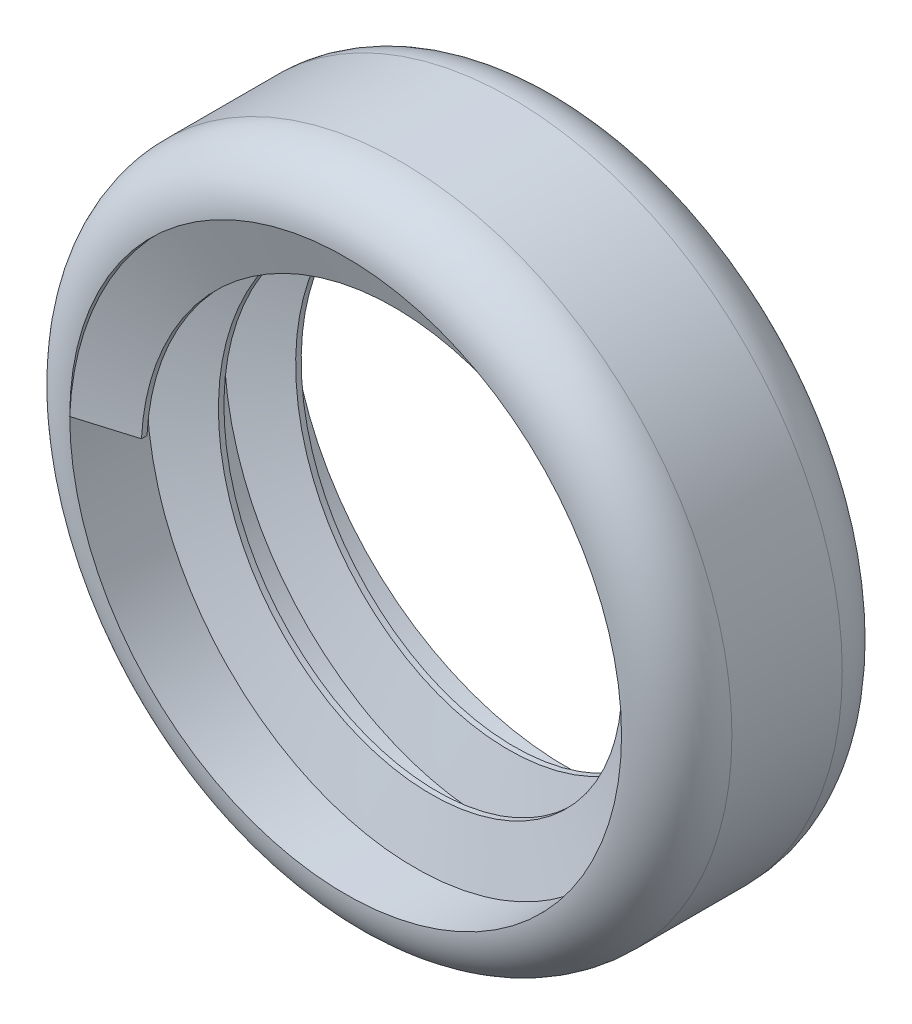
ISO-10303-21;
HEADER;
FILE_DESCRIPTION(('STEP AP214'),'2;1');
FILE_NAME('part.step','',(''),(''),'','','');
FILE_SCHEMA(('AUTOMOTIVE_DESIGN { 1 0 10303 214 1 1 1 1 }'));
ENDSEC;
DATA;
#1=APPLICATION_CONTEXT('core data for automotive mechanical design processes');
#2=APPLICATION_PROTOCOL_DEFINITION('international standard','automotive_design',2000,#1);
#3=PRODUCT_CONTEXT('',#1,'mechanical');
#4=PRODUCT('Part','Part','',(#3));
#5=PRODUCT_RELATED_PRODUCT_CATEGORY('part','',(#4));
#6=PRODUCT_DEFINITION_FORMATION('','',#4);
#7=PRODUCT_DEFINITION_CONTEXT('part definition',#1,'design');
#8=PRODUCT_DEFINITION('design','',#6,#7);
#9=PRODUCT_DEFINITION_SHAPE('','',#8);
#10=(LENGTH_UNIT() NAMED_UNIT(*) SI_UNIT(.MILLI.,.METRE.));
#11=(NAMED_UNIT(*) PLANE_ANGLE_UNIT() SI_UNIT($,.RADIAN.));
#12=(NAMED_UNIT(*) SI_UNIT($,.STERADIAN.) SOLID_ANGLE_UNIT());
#13=UNCERTAINTY_MEASURE_WITH_UNIT(LENGTH_MEASURE(1.E-05),#10,'distance_accuracy_value','');
#14=(GEOMETRIC_REPRESENTATION_CONTEXT(3) GLOBAL_UNCERTAINTY_ASSIGNED_CONTEXT((#13)) GLOBAL_UNIT_ASSIGNED_CONTEXT((#10,
#11,#12)) REPRESENTATION_CONTEXT('',''));
#15=CARTESIAN_POINT('',(0.,0.,0.));
#16=DIRECTION('',(0.,0.,1.));
#17=DIRECTION('',(1.,0.,0.));
#18=AXIS2_PLACEMENT_3D('',#15,#16,#17);
#19=CARTESIAN_POINT('',(4.25,0.,0.275));
#20=DIRECTION('',(0.,-1.,0.));
#21=DIRECTION('',(1.,0.,0.));
#22=AXIS2_PLACEMENT_3D('',#19,#20,#21);
#23=PLANE('',#22);
#24=CARTESIAN_POINT('',(5.,0.,-0.2));
#25=CARTESIAN_POINT('',(4.,0.,0.0999999999999998));
#26=(BOUNDED_CURVE() B_SPLINE_CURVE(1,(#24,#25),.UNSPECIFIED.,.F.,
.F.) B_SPLINE_CURVE_WITH_KNOTS((2,2),(0.,1.),
.UNSPECIFIED.) CURVE() GEOMETRIC_REPRESENTATION_ITEM() RATIONAL_B_SPLINE_CURVE((1.,1.)) REPRESENTATION_ITEM(''));
#27=CARTESIAN_POINT('',(4.33333333333333,0.,0.));
#28=VERTEX_POINT('',#27);
#29=CARTESIAN_POINT('',(4.,0.,0.0999999999999998));
#30=VERTEX_POINT('',#29);
#31=EDGE_CURVE('E102',#28,#30,#26,.T.);
#32=ORIENTED_EDGE('',*,*,#31,.F.);
#33=DIRECTION('',(1.,0.,0.));
#34=VECTOR('',#33,1.);
#35=CARTESIAN_POINT('',(4.25,0.,0.));
#36=LINE('',#35,#34);
#37=CARTESIAN_POINT('',(5.,0.,0.));
#38=VERTEX_POINT('',#37);
#39=EDGE_CURVE('E51',#28,#38,#36,.T.);
#40=ORIENTED_EDGE('',*,*,#39,.T.);
#41=CARTESIAN_POINT('',(5.,0.,0.5));
#42=DIRECTION('',(0.,0.,-1.));
#43=VECTOR('',#42,1.);
#44=LINE('',#41,#43);
#45=CARTESIAN_POINT('',(5.,0.,0.5));
#46=VERTEX_POINT('',#45);
#47=EDGE_CURVE('E108',#46,#38,#44,.T.);
#48=ORIENTED_EDGE('',*,*,#47,.F.);
#49=CARTESIAN_POINT('',(4.,0.,0.2));
#50=CARTESIAN_POINT('',(5.,0.,0.5));
#51=(BOUNDED_CURVE() B_SPLINE_CURVE(1,(#49,#50),.UNSPECIFIED.,.F.,
.F.) B_SPLINE_CURVE_WITH_KNOTS((2,2),(0.,1.),
.UNSPECIFIED.) CURVE() GEOMETRIC_REPRESENTATION_ITEM() RATIONAL_B_SPLINE_CURVE((1.,1.)) REPRESENTATION_ITEM(''));
#52=CARTESIAN_POINT('',(4.,0.,0.2));
#53=VERTEX_POINT('',#52);
#54=EDGE_CURVE('E110',#53,#46,#51,.T.);
#55=ORIENTED_EDGE('',*,*,#54,.F.);
#56=CARTESIAN_POINT('',(4.,0.,0.0999999999999998));
#57=CARTESIAN_POINT('',(4.,0.,0.2));
#58=(BOUNDED_CURVE() B_SPLINE_CURVE(1,(#56,#57),.UNSPECIFIED.,.F.,
.F.) B_SPLINE_CURVE_WITH_KNOTS((2,2),(0.,1.),
.UNSPECIFIED.) CURVE() GEOMETRIC_REPRESENTATION_ITEM() RATIONAL_B_SPLINE_CURVE((1.,1.)) REPRESENTATION_ITEM(''));
#59=EDGE_CURVE('E162',#30,#53,#58,.T.);
#60=ORIENTED_EDGE('',*,*,#59,.F.);
#61=EDGE_LOOP('',(#32,#40,#48,#55,#60));
#62=FACE_BOUND('',#61,.T.);
#63=ADVANCED_FACE('F36',(#62),#23,.T.);
#64=CARTESIAN_POINT('',(-4.,0.,3.6));
#65=CARTESIAN_POINT('',(-4.,1.65685424949238,3.5125));
#66=CARTESIAN_POINT('',(-2.82842712474619,2.82842712474619,3.425));
#67=CARTESIAN_POINT('',(-1.65685424949238,4.,3.3375));
#68=CARTESIAN_POINT('',(0.,4.,3.25));
#69=CARTESIAN_POINT('',(1.65685424949238,4.,3.1625));
#70=CARTESIAN_POINT('',(2.82842712474619,2.82842712474619,3.075));
#71=CARTESIAN_POINT('',(4.,1.65685424949238,2.9875));
#72=CARTESIAN_POINT('',(4.,0.,2.9));
#73=CARTESIAN_POINT('',(4.,-1.65685424949238,2.8125));
#74=CARTESIAN_POINT('',(2.82842712474619,-2.82842712474619,2.725));
#75=CARTESIAN_POINT('',(1.65685424949238,-4.,2.6375));
#76=CARTESIAN_POINT('',(0.,-4.,2.55));
#77=CARTESIAN_POINT('',(-1.65685424949238,-4.,2.4625));
#78=CARTESIAN_POINT('',(-2.82842712474619,-2.82842712474619,2.375));
#79=CARTESIAN_POINT('',(-4.,-1.65685424949238,2.2875));
#80=CARTESIAN_POINT('',(-4.,0.,2.2));
#81=CARTESIAN_POINT('',(-4.,1.65685424949238,2.1125));
#82=CARTESIAN_POINT('',(-2.82842712474619,2.82842712474619,2.025));
#83=CARTESIAN_POINT('',(-1.65685424949238,4.,1.9375));
#84=CARTESIAN_POINT('',(0.,4.,1.85));
#85=CARTESIAN_POINT('',(1.65685424949238,4.,1.7625));
#86=CARTESIAN_POINT('',(2.82842712474619,2.82842712474619,1.675));
#87=CARTESIAN_POINT('',(4.,1.65685424949238,1.5875));
#88=CARTESIAN_POINT('',(4.,0.,1.5));
#89=CARTESIAN_POINT('',(4.,-1.65685424949238,1.4125));
#90=CARTESIAN_POINT('',(2.82842712474619,-2.82842712474619,1.325));
#91=CARTESIAN_POINT('',(1.65685424949238,-4.,1.2375));
#92=CARTESIAN_POINT('',(0.,-4.,1.15));
#93=CARTESIAN_POINT('',(-1.65685424949238,-4.,1.0625));
#94=CARTESIAN_POINT('',(-2.82842712474619,-2.82842712474619,0.975));
#95=CARTESIAN_POINT('',(-4.,-1.65685424949238,0.8875));
#96=CARTESIAN_POINT('',(-4.,0.,0.8));
#97=CARTESIAN_POINT('',(-4.,1.65685424949238,0.7125));
#98=CARTESIAN_POINT('',(-2.82842712474619,2.82842712474619,0.625));
#99=CARTESIAN_POINT('',(-1.65685424949238,4.,0.5375));
#100=CARTESIAN_POINT('',(0.,4.,0.45));
#101=CARTESIAN_POINT('',(1.65685424949238,4.,0.3625));
#102=CARTESIAN_POINT('',(2.82842712474619,2.82842712474619,0.275));
#103=CARTESIAN_POINT('',(4.,1.65685424949238,0.1875));
#104=CARTESIAN_POINT('',(4.,0.,0.0999999999999998));
#105=CARTESIAN_POINT('',(-5.,0.,3.3));
#106=CARTESIAN_POINT('',(-5.,2.07106781186548,3.2125));
#107=CARTESIAN_POINT('',(-3.53553390593274,3.53553390593274,3.125));
#108=CARTESIAN_POINT('',(-2.07106781186548,5.,3.0375));
#109=CARTESIAN_POINT('',(0.,5.,2.95));
#110=CARTESIAN_POINT('',(2.07106781186548,5.,2.8625));
#111=CARTESIAN_POINT('',(3.53553390593274,3.53553390593274,2.775));
#112=CARTESIAN_POINT('',(5.,2.07106781186548,2.6875));
#113=CARTESIAN_POINT('',(5.,0.,2.6));
#114=CARTESIAN_POINT('',(5.,-2.07106781186547,2.5125));
#115=CARTESIAN_POINT('',(3.53553390593274,-3.53553390593274,2.425));
#116=CARTESIAN_POINT('',(2.07106781186548,-5.,2.3375));
#117=CARTESIAN_POINT('',(0.,-5.,2.25));
#118=CARTESIAN_POINT('',(-2.07106781186548,-5.,2.1625));
#119=CARTESIAN_POINT('',(-3.53553390593274,-3.53553390593274,2.075));
#120=CARTESIAN_POINT('',(-5.,-2.07106781186548,1.9875));
#121=CARTESIAN_POINT('',(-5.,0.,1.9));
#122=CARTESIAN_POINT('',(-5.,2.07106781186548,1.8125));
#123=CARTESIAN_POINT('',(-3.53553390593274,3.53553390593274,1.725));
#124=CARTESIAN_POINT('',(-2.07106781186548,5.,1.6375));
#125=CARTESIAN_POINT('',(0.,5.,1.55));
#126=CARTESIAN_POINT('',(2.07106781186548,5.,1.4625));
#127=CARTESIAN_POINT('',(3.53553390593274,3.53553390593274,1.375));
#128=CARTESIAN_POINT('',(5.,2.07106781186548,1.2875));
#129=CARTESIAN_POINT('',(5.,0.,1.2));
#130=CARTESIAN_POINT('',(5.,-2.07106781186547,1.1125));
#131=CARTESIAN_POINT('',(3.53553390593274,-3.53553390593274,1.025));
#132=CARTESIAN_POINT('',(2.07106781186548,-5.,0.9375));
#133=CARTESIAN_POINT('',(0.,-5.,0.85));
#134=CARTESIAN_POINT('',(-2.07106781186548,-5.,0.7625));
#135=CARTESIAN_POINT('',(-3.53553390593274,-3.53553390593274,0.675));
#136=CARTESIAN_POINT('',(-5.,-2.07106781186548,0.5875));
#137=CARTESIAN_POINT('',(-5.,0.,0.5));
#138=CARTESIAN_POINT('',(-5.,2.07106781186548,0.4125));
#139=CARTESIAN_POINT('',(-3.53553390593274,3.53553390593274,0.325));
#140=CARTESIAN_POINT('',(-2.07106781186548,5.,0.2375));
#141=CARTESIAN_POINT('',(0.,5.,0.15));
#142=CARTESIAN_POINT('',(2.07106781186548,5.,0.0625000000000001));
#143=CARTESIAN_POINT('',(3.53553390593274,3.53553390593274,-0.0249999999999998));
#144=CARTESIAN_POINT('',(5.,2.07106781186548,-0.1125));
#145=CARTESIAN_POINT('',(5.,0.,-0.2));
#146=(BOUNDED_SURFACE() B_SPLINE_SURFACE(1,2,((#64,#65,#66,#67,#68,#69,#70,#71,#72,#73,#74,#75,
#76,#77,#78,#79,#80,#81,#82,#83,#84,#85,#86,#87,#88,#89,#90,#91,#92,#93,#94,#95,#96,#97,#98,#99,
#100,#101,#102,#103,#104),(#105,#106,#107,#108,#109,#110,#111,#112,#113,#114,#115,#116,#117,
#118,#119,#120,#121,#122,#123,#124,#125,#126,#127,#128,#129,#130,#131,#132,#133,#134,#135,#136,
#137,#138,#139,#140,#141,#142,#143,#144,#145)),.UNSPECIFIED.,.F.,.F.,
.F.) B_SPLINE_SURFACE_WITH_KNOTS((2,2),(3,2,2,2,2,2,2,2,2,2,2,2,2,2,2,2,2,2,2,2,3),(0.,1.),(0.,
0.0416666666666667,0.0833333333333333,0.125,0.166666666666667,0.208333333333333,0.25,
0.291666666666667,0.333333333333333,0.375,0.416666666666667,0.458333333333333,0.5,
0.541666666666667,0.583333333333333,0.625,0.666666666666667,0.708333333333333,0.75,
0.791666666666667,0.833333333333333),
.UNSPECIFIED.) GEOMETRIC_REPRESENTATION_ITEM() RATIONAL_B_SPLINE_SURFACE(((1.,0.923879532511287,
1.,0.923879532511287,1.,0.923879532511287,1.,0.923879532511287,1.,0.923879532511287,1.,
0.923879532511287,1.,0.923879532511287,1.,0.923879532511287,1.,0.923879532511287,1.,
0.923879532511287,1.,0.923879532511287,1.,0.923879532511287,1.,0.923879532511287,1.,
0.923879532511287,1.,0.923879532511287,1.,0.923879532511287,1.,0.923879532511287,1.,
0.923879532511287,1.,0.923879532511287,1.,0.923879532511287,1.),(1.,0.923879532511287,1.,
0.923879532511287,1.,0.923879532511287,1.,0.923879532511287,1.,0.923879532511287,1.,
0.923879532511287,1.,0.923879532511287,1.,0.923879532511287,1.,0.923879532511287,1.,
0.923879532511287,1.,0.923879532511287,1.,0.923879532511287,1.,0.923879532511287,1.,
0.923879532511287,1.,0.923879532511287,1.,0.923879532511287,1.,0.923879532511287,1.,
0.923879532511287,1.,0.923879532511287,1.,0.923879532511287,1.))) REPRESENTATION_ITEM('') SURFACE());
#147=CARTESIAN_POINT('',(-5.,0.,3.3));
#148=CARTESIAN_POINT('',(-5.,2.07106781186548,3.2125));
#149=CARTESIAN_POINT('',(-3.53553390593274,3.53553390593274,3.125));
#150=CARTESIAN_POINT('',(-2.07106781186548,5.,3.0375));
#151=CARTESIAN_POINT('',(0.,5.,2.95));
#152=CARTESIAN_POINT('',(2.07106781186548,5.,2.8625));
#153=CARTESIAN_POINT('',(3.53553390593274,3.53553390593274,2.775));
#154=CARTESIAN_POINT('',(5.,2.07106781186548,2.6875));
#155=CARTESIAN_POINT('',(5.,0.,2.6));
#156=CARTESIAN_POINT('',(5.,-2.07106781186547,2.5125));
#157=CARTESIAN_POINT('',(3.53553390593274,-3.53553390593274,2.425));
#158=CARTESIAN_POINT('',(2.07106781186548,-5.,2.3375));
#159=CARTESIAN_POINT('',(0.,-5.,2.25));
#160=CARTESIAN_POINT('',(-2.07106781186548,-5.,2.1625));
#161=CARTESIAN_POINT('',(-3.53553390593274,-3.53553390593274,2.075));
#162=CARTESIAN_POINT('',(-5.,-2.07106781186548,1.9875));
#163=CARTESIAN_POINT('',(-5.,0.,1.9));
#164=CARTESIAN_POINT('',(-5.,2.07106781186548,1.8125));
#165=CARTESIAN_POINT('',(-3.53553390593274,3.53553390593274,1.725));
#166=CARTESIAN_POINT('',(-2.07106781186548,5.,1.6375));
#167=CARTESIAN_POINT('',(0.,5.,1.55));
#168=CARTESIAN_POINT('',(2.07106781186548,5.,1.4625));
#169=CARTESIAN_POINT('',(3.53553390593274,3.53553390593274,1.375));
#170=CARTESIAN_POINT('',(5.,2.07106781186548,1.2875));
#171=CARTESIAN_POINT('',(5.,0.,1.2));
#172=CARTESIAN_POINT('',(5.,-2.07106781186547,1.1125));
#173=CARTESIAN_POINT('',(3.53553390593274,-3.53553390593274,1.025));
#174=CARTESIAN_POINT('',(2.07106781186548,-5.,0.9375));
#175=CARTESIAN_POINT('',(0.,-5.,0.85));
#176=CARTESIAN_POINT('',(-2.07106781186548,-5.,0.7625));
#177=CARTESIAN_POINT('',(-3.53553390593274,-3.53553390593274,0.675));
#178=CARTESIAN_POINT('',(-5.,-2.07106781186548,0.5875));
#179=CARTESIAN_POINT('',(-5.,0.,0.5));
#180=CARTESIAN_POINT('',(-5.,2.07106781186548,0.4125));
#181=CARTESIAN_POINT('',(-3.53553390593274,3.53553390593274,0.325));
#182=CARTESIAN_POINT('',(-2.07106781186548,5.,0.2375));
#183=CARTESIAN_POINT('',(0.,5.,0.15));
#184=CARTESIAN_POINT('',(2.07106781186548,5.,0.0625000000000001));
#185=CARTESIAN_POINT('',(3.53553390593274,3.53553390593274,-0.0249999999999998));
#186=CARTESIAN_POINT('',(5.,2.07106781186548,-0.1125));
#187=CARTESIAN_POINT('',(5.,0.,-0.2));
#188=(BOUNDED_CURVE() B_SPLINE_CURVE(2,(#147,#148,#149,#150,#151,#152,#153,#154,#155,#156,#157,
#158,#159,#160,#161,#162,#163,#164,#165,#166,#167,#168,#169,#170,#171,#172,#173,#174,#175,#176,
#177,#178,#179,#180,#181,#182,#183,#184,#185,#186,#187),.UNSPECIFIED.,.F.,
.F.) B_SPLINE_CURVE_WITH_KNOTS((3,2,2,2,2,2,2,2,2,2,2,2,2,2,2,2,2,2,2,2,3),(0.,
0.0416666666666667,0.0833333333333333,0.125,0.166666666666667,0.208333333333333,0.25,
0.291666666666667,0.333333333333333,0.375,0.416666666666667,0.458333333333333,0.5,
0.541666666666667,0.583333333333333,0.625,0.666666666666667,0.708333333333333,0.75,
0.791666666666667,0.833333333333333),
.UNSPECIFIED.) CURVE() GEOMETRIC_REPRESENTATION_ITEM() RATIONAL_B_SPLINE_CURVE((1.,
0.923879532511287,1.,0.923879532511287,1.,0.923879532511287,1.,0.923879532511287,1.,
0.923879532511287,1.,0.923879532511287,1.,0.923879532511287,1.,0.923879532511287,1.,
0.923879532511287,1.,0.923879532511287,1.,0.923879532511287,1.,0.923879532511287,1.,
0.923879532511287,1.,0.923879532511287,1.,0.923879532511287,1.,0.923879532511287,1.,
0.923879532511287,1.,0.923879532511287,1.,0.923879532511287,1.,0.923879532511287,1.)) REPRESENTATION_ITEM(''));
#189=CARTESIAN_POINT('',(-5.,0.,3.3));
#190=VERTEX_POINT('',#189);
#191=CARTESIAN_POINT('',(3.10323721467299,3.92044879949587,0.));
#192=VERTEX_POINT('',#191);
#193=EDGE_CURVE('E97',#190,#192,#188,.T.);
#194=CARTESIAN_POINT('',(3.10323721467299,3.92044879949587,0.));
#195=CARTESIAN_POINT('',(3.15017778654,3.87062506277621,0.));
#196=CARTESIAN_POINT('',(3.19613030104344,3.81986518571381,0.));
#197=CARTESIAN_POINT('',(3.28599126948318,3.71654255023196,0.));
#198=CARTESIAN_POINT('',(3.32989915250401,3.66397929529308,0.));
#199=CARTESIAN_POINT('',(3.39416553508999,3.5838449232206,0.));
#200=CARTESIAN_POINT('',(3.41532563863535,3.55691329198676,0.));
#201=CARTESIAN_POINT('',(3.45711612002527,3.50264237650388,0.));
#202=CARTESIAN_POINT('',(3.47774650416607,3.47530309710625,0.));
#203=CARTESIAN_POINT('',(3.53871845004469,3.39260456252487,0.));
#204=CARTESIAN_POINT('',(3.57814172025358,3.33656347900865,0.));
#205=CARTESIAN_POINT('',(3.65444140698257,3.22278004361646,0.));
#206=CARTESIAN_POINT('',(3.69131797891683,3.16503779586265,0.));
#207=CARTESIAN_POINT('',(3.76245256328678,3.0479655641325,0.));
#208=CARTESIAN_POINT('',(3.79671050818374,2.98863553925801,0.));
#209=CARTESIAN_POINT('',(3.89542923626734,2.80846488327959,0.));
#210=CARTESIAN_POINT('',(3.9558719530183,2.68538842776613,0.));
#211=CARTESIAN_POINT('',(4.06460022200251,2.43634818069197,0.));
#212=CARTESIAN_POINT('',(4.11306511070666,2.31046229130144,0.));
#213=CARTESIAN_POINT('',(4.19869997360584,2.05487778701631,0.));
#214=CARTESIAN_POINT('',(4.23586816059756,1.9251785723877,0.));
#215=CARTESIAN_POINT('',(4.29854577219183,1.66317715329423,0.));
#216=CARTESIAN_POINT('',(4.3240710407358,1.53087874330922,0.));
#217=CARTESIAN_POINT('',(4.36332425881931,1.26460372170163,0.));
#218=CARTESIAN_POINT('',(4.37705607568327,1.13062767484475,0.));
#219=CARTESIAN_POINT('',(4.39447234504749,0.829907838751561,0.));
#220=CARTESIAN_POINT('',(4.39498285286293,0.662963337084148,0.));
#221=CARTESIAN_POINT('',(4.38207178182444,0.413390890946088,0.));
#222=CARTESIAN_POINT('',(4.37549008797268,0.330349836678299,0.));
#223=CARTESIAN_POINT('',(4.35779946492874,0.164757218486155,0.));
#224=CARTESIAN_POINT('',(4.3466908547457,0.0822056204858993,0.));
#225=CARTESIAN_POINT('',(4.33333333333333,0.,0.));
#226=B_SPLINE_CURVE_WITH_KNOTS('',3,(#194,#195,#196,#197,#198,#199,#200,#201,#202,#203,#204,
#205,#206,#207,#208,#209,#210,#211,#212,#213,#214,#215,#216,#217,#218,#219,#220,#221,#222,#223,
#224,#225),.UNSPECIFIED.,.F.,.F.,(4,2,2,2,2,2,2,2,2,2,2,2,2,2,2,4),(0.,0.205353242970149,
0.410763486353989,0.513507802383417,0.616250896628023,0.821732722376315,1.02720199734183,
1.23267656991303,1.64342689497409,2.04759335299404,2.45182371923402,2.8555023465794,
3.2590485484921,3.75875666264931,4.00855604023993,4.25833781765719),.UNSPECIFIED.);
#227=EDGE_CURVE('E88',#192,#28,#226,.T.);
#228=CARTESIAN_POINT('',(-4.,0.,3.6));
#229=CARTESIAN_POINT('',(-4.,1.65685424949238,3.5125));
#230=CARTESIAN_POINT('',(-2.82842712474619,2.82842712474619,3.425));
#231=CARTESIAN_POINT('',(-1.65685424949238,4.,3.3375));
#232=CARTESIAN_POINT('',(0.,4.,3.25));
#233=CARTESIAN_POINT('',(1.65685424949238,4.,3.1625));
#234=CARTESIAN_POINT('',(2.82842712474619,2.82842712474619,3.075));
#235=CARTESIAN_POINT('',(4.,1.65685424949238,2.9875));
#236=CARTESIAN_POINT('',(4.,0.,2.9));
#237=CARTESIAN_POINT('',(4.,-1.65685424949238,2.8125));
#238=CARTESIAN_POINT('',(2.82842712474619,-2.82842712474619,2.725));
#239=CARTESIAN_POINT('',(1.65685424949238,-4.,2.6375));
#240=CARTESIAN_POINT('',(0.,-4.,2.55));
#241=CARTESIAN_POINT('',(-1.65685424949238,-4.,2.4625));
#242=CARTESIAN_POINT('',(-2.82842712474619,-2.82842712474619,2.375));
#243=CARTESIAN_POINT('',(-4.,-1.65685424949238,2.2875));
#244=CARTESIAN_POINT('',(-4.,0.,2.2));
#245=CARTESIAN_POINT('',(-4.,1.65685424949238,2.1125));
#246=CARTESIAN_POINT('',(-2.82842712474619,2.82842712474619,2.025));
#247=CARTESIAN_POINT('',(-1.65685424949238,4.,1.9375));
#248=CARTESIAN_POINT('',(0.,4.,1.85));
#249=CARTESIAN_POINT('',(1.65685424949238,4.,1.7625));
#250=CARTESIAN_POINT('',(2.82842712474619,2.82842712474619,1.675));
#251=CARTESIAN_POINT('',(4.,1.65685424949238,1.5875));
#252=CARTESIAN_POINT('',(4.,0.,1.5));
#253=CARTESIAN_POINT('',(4.,-1.65685424949238,1.4125));
#254=CARTESIAN_POINT('',(2.82842712474619,-2.82842712474619,1.325));
#255=CARTESIAN_POINT('',(1.65685424949238,-4.,1.2375));
#256=CARTESIAN_POINT('',(0.,-4.,1.15));
#257=CARTESIAN_POINT('',(-1.65685424949238,-4.,1.0625));
#258=CARTESIAN_POINT('',(-2.82842712474619,-2.82842712474619,0.975));
#259=CARTESIAN_POINT('',(-4.,-1.65685424949238,0.8875));
#260=CARTESIAN_POINT('',(-4.,0.,0.8));
#261=CARTESIAN_POINT('',(-4.,1.65685424949238,0.7125));
#262=CARTESIAN_POINT('',(-2.82842712474619,2.82842712474619,0.625));
#263=CARTESIAN_POINT('',(-1.65685424949238,4.,0.5375));
#264=CARTESIAN_POINT('',(0.,4.,0.45));
#265=CARTESIAN_POINT('',(1.65685424949238,4.,0.3625));
#266=CARTESIAN_POINT('',(2.82842712474619,2.82842712474619,0.275));
#267=CARTESIAN_POINT('',(4.,1.65685424949238,0.1875));
#268=CARTESIAN_POINT('',(4.,0.,0.0999999999999998));
#269=(BOUNDED_CURVE() B_SPLINE_CURVE(2,(#228,#229,#230,#231,#232,#233,#234,#235,#236,#237,#238,
#239,#240,#241,#242,#243,#244,#245,#246,#247,#248,#249,#250,#251,#252,#253,#254,#255,#256,#257,
#258,#259,#260,#261,#262,#263,#264,#265,#266,#267,#268),.UNSPECIFIED.,.F.,
.F.) B_SPLINE_CURVE_WITH_KNOTS((3,2,2,2,2,2,2,2,2,2,2,2,2,2,2,2,2,2,2,2,3),(0.,
0.0416666666666667,0.0833333333333333,0.125,0.166666666666667,0.208333333333333,0.25,
0.291666666666667,0.333333333333333,0.375,0.416666666666667,0.458333333333333,0.5,
0.541666666666667,0.583333333333333,0.625,0.666666666666667,0.708333333333333,0.75,
0.791666666666667,0.833333333333333),
.UNSPECIFIED.) CURVE() GEOMETRIC_REPRESENTATION_ITEM() RATIONAL_B_SPLINE_CURVE((1.,
0.923879532511287,1.,0.923879532511287,1.,0.923879532511287,1.,0.923879532511287,1.,
0.923879532511287,1.,0.923879532511287,1.,0.923879532511287,1.,0.923879532511287,1.,
0.923879532511287,1.,0.923879532511287,1.,0.923879532511287,1.,0.923879532511287,1.,
0.923879532511287,1.,0.923879532511287,1.,0.923879532511287,1.,0.923879532511287,1.,
0.923879532511287,1.,0.923879532511287,1.,0.923879532511287,1.,0.923879532511287,1.)) REPRESENTATION_ITEM(''));
#270=CARTESIAN_POINT('',(-4.,0.,3.6));
#271=VERTEX_POINT('',#270);
#272=EDGE_CURVE('E195',#271,#30,#269,.T.);
#273=DIRECTION('',(-0.957826285221151,0.,-0.287347885566345));
#274=VECTOR('',#273,1.);
#275=CARTESIAN_POINT('',(-4.5,0.,3.45));
#276=LINE('',#275,#274);
#277=EDGE_CURVE('E100',#271,#190,#276,.T.);
#278=ORIENTED_EDGE('',*,*,#193,.T.);
#279=ORIENTED_EDGE('',*,*,#227,.T.);
#280=ORIENTED_EDGE('',*,*,#31,.T.);
#281=ORIENTED_EDGE('',*,*,#272,.F.);
#282=ORIENTED_EDGE('',*,*,#277,.T.);
#283=EDGE_LOOP('',(#278,#279,#280,#281,#282));
#284=FACE_BOUND('',#283,.T.);
#285=ADVANCED_FACE('F98',(#284),#146,.T.);
#286=CARTESIAN_POINT('',(0.,0.,4.));
#287=DIRECTION('',(0.,0.,-1.));
#288=DIRECTION('',(-1.,0.,0.));
#289=AXIS2_PLACEMENT_3D('',#286,#287,#288);
#290=CYLINDRICAL_SURFACE('',#289,5.);
#291=CARTESIAN_POINT('',(0.,0.,4.));
#292=DIRECTION('',(0.,0.,1.));
#293=DIRECTION('',(1.,0.,0.));
#294=AXIS2_PLACEMENT_3D('',#291,#292,#293);
#295=CIRCLE('',#294,5.);
#296=CARTESIAN_POINT('',(-5.,0.,4.));
#297=VERTEX_POINT('',#296);
#298=EDGE_CURVE('E94',#297,#297,#295,.T.);
#299=ORIENTED_EDGE('',*,*,#298,.T.);
#300=CARTESIAN_POINT('',(-5.,0.,4.));
#301=CARTESIAN_POINT('',(-5.,2.07106781186548,3.9125));
#302=CARTESIAN_POINT('',(-3.53553390593274,3.53553390593274,3.825));
#303=CARTESIAN_POINT('',(-2.07106781186548,5.,3.7375));
#304=CARTESIAN_POINT('',(0.,5.,3.65));
#305=CARTESIAN_POINT('',(2.07106781186548,5.,3.5625));
#306=CARTESIAN_POINT('',(3.53553390593274,3.53553390593274,3.475));
#307=CARTESIAN_POINT('',(5.,2.07106781186548,3.3875));
#308=CARTESIAN_POINT('',(5.,0.,3.3));
#309=CARTESIAN_POINT('',(5.,-2.07106781186547,3.2125));
#310=CARTESIAN_POINT('',(3.53553390593274,-3.53553390593274,3.125));
#311=CARTESIAN_POINT('',(2.07106781186548,-5.,3.0375));
#312=CARTESIAN_POINT('',(0.,-5.,2.95));
#313=CARTESIAN_POINT('',(-2.07106781186548,-5.,2.8625));
#314=CARTESIAN_POINT('',(-3.53553390593274,-3.53553390593274,2.775));
#315=CARTESIAN_POINT('',(-5.,-2.07106781186548,2.6875));
#316=CARTESIAN_POINT('',(-5.,0.,2.6));
#317=CARTESIAN_POINT('',(-5.,2.07106781186548,2.5125));
#318=CARTESIAN_POINT('',(-3.53553390593274,3.53553390593274,2.425));
#319=CARTESIAN_POINT('',(-2.07106781186548,5.,2.3375));
#320=CARTESIAN_POINT('',(0.,5.,2.25));
#321=CARTESIAN_POINT('',(2.07106781186548,5.,2.1625));
#322=CARTESIAN_POINT('',(3.53553390593274,3.53553390593274,2.075));
#323=CARTESIAN_POINT('',(5.,2.07106781186548,1.9875));
#324=CARTESIAN_POINT('',(5.,0.,1.9));
#325=CARTESIAN_POINT('',(5.,-2.07106781186547,1.8125));
#326=CARTESIAN_POINT('',(3.53553390593274,-3.53553390593274,1.725));
#327=CARTESIAN_POINT('',(2.07106781186548,-5.,1.6375));
#328=CARTESIAN_POINT('',(0.,-5.,1.55));
#329=CARTESIAN_POINT('',(-2.07106781186548,-5.,1.4625));
#330=CARTESIAN_POINT('',(-3.53553390593274,-3.53553390593274,1.375));
#331=CARTESIAN_POINT('',(-5.,-2.07106781186548,1.2875));
#332=CARTESIAN_POINT('',(-5.,0.,1.2));
#333=CARTESIAN_POINT('',(-5.,2.07106781186548,1.1125));
#334=CARTESIAN_POINT('',(-3.53553390593274,3.53553390593274,1.025));
#335=CARTESIAN_POINT('',(-2.07106781186548,5.,0.9375));
#336=CARTESIAN_POINT('',(0.,5.,0.85));
#337=CARTESIAN_POINT('',(2.07106781186548,5.,0.7625));
#338=CARTESIAN_POINT('',(3.53553390593274,3.53553390593274,0.675));
#339=CARTESIAN_POINT('',(5.,2.07106781186548,0.5875));
#340=CARTESIAN_POINT('',(5.,0.,0.5));
#341=(BOUNDED_CURVE() B_SPLINE_CURVE(2,(#300,#301,#302,#303,#304,#305,#306,#307,#308,#309,#310,
#311,#312,#313,#314,#315,#316,#317,#318,#319,#320,#321,#322,#323,#324,#325,#326,#327,#328,#329,
#330,#331,#332,#333,#334,#335,#336,#337,#338,#339,#340),.UNSPECIFIED.,.F.,
.F.) B_SPLINE_CURVE_WITH_KNOTS((3,2,2,2,2,2,2,2,2,2,2,2,2,2,2,2,2,2,2,2,3),(0.,
0.0416666666666667,0.0833333333333333,0.125,0.166666666666667,0.208333333333333,0.25,
0.291666666666667,0.333333333333333,0.375,0.416666666666667,0.458333333333333,0.5,
0.541666666666667,0.583333333333333,0.625,0.666666666666667,0.708333333333333,0.75,
0.791666666666667,0.833333333333333),
.UNSPECIFIED.) CURVE() GEOMETRIC_REPRESENTATION_ITEM() RATIONAL_B_SPLINE_CURVE((1.,
0.923879532511287,1.,0.923879532511287,1.,0.923879532511287,1.,0.923879532511287,1.,
0.923879532511287,1.,0.923879532511287,1.,0.923879532511287,1.,0.923879532511287,1.,
0.923879532511287,1.,0.923879532511287,1.,0.923879532511287,1.,0.923879532511287,1.,
0.923879532511287,1.,0.923879532511287,1.,0.923879532511287,1.,0.923879532511287,1.,
0.923879532511287,1.,0.923879532511287,1.,0.923879532511287,1.,0.923879532511287,1.)) REPRESENTATION_ITEM(''));
#342=EDGE_CURVE('E190',#297,#46,#341,.T.);
#343=ORIENTED_EDGE('',*,*,#342,.T.);
#344=ORIENTED_EDGE('',*,*,#47,.T.);
#345=CARTESIAN_POINT('',(0.,0.,0.));
#346=DIRECTION('',(0.,0.,1.));
#347=DIRECTION('',(1.,0.,0.));
#348=AXIS2_PLACEMENT_3D('',#345,#346,#347);
#349=CIRCLE('',#348,5.);
#350=EDGE_CURVE('E87',#192,#38,#349,.T.);
#351=ORIENTED_EDGE('',*,*,#350,.F.);
#352=ORIENTED_EDGE('',*,*,#193,.F.);
#353=DIRECTION('',(0.,0.,1.));
#354=VECTOR('',#353,1.);
#355=CARTESIAN_POINT('',(-5.,0.,3.65));
#356=LINE('',#355,#354);
#357=EDGE_CURVE('E59',#190,#297,#356,.T.);
#358=ORIENTED_EDGE('',*,*,#357,.T.);
#359=EDGE_LOOP('',(#299,#343,#344,#351,#352,#358));
#360=FACE_BOUND('',#359,.T.);
#361=ADVANCED_FACE('F106',(#360),#290,.F.);
#362=CARTESIAN_POINT('',(0.,0.,0.));
#363=DIRECTION('',(0.,0.,1.));
#364=DIRECTION('',(1.,0.,0.));
#365=AXIS2_PLACEMENT_3D('',#362,#363,#364);
#366=PLANE('',#365);
#367=ORIENTED_EDGE('',*,*,#227,.F.);
#368=CARTESIAN_POINT('',(0.,0.,0.));
#369=DIRECTION('',(0.,0.,1.));
#370=DIRECTION('',(1.,0.,0.));
#371=AXIS2_PLACEMENT_3D('',#368,#369,#370);
#372=CIRCLE('',#371,5.);
#373=EDGE_CURVE('E12',#192,#38,#372,.F.);
#374=ORIENTED_EDGE('',*,*,#373,.T.);
#375=ORIENTED_EDGE('',*,*,#39,.F.);
#376=EDGE_LOOP('',(#367,#374,#375));
#377=FACE_BOUND('',#376,.T.);
#378=ADVANCED_FACE('F90',(#377),#366,.F.);
#379=CARTESIAN_POINT('',(0.,0.,4.));
#380=DIRECTION('',(0.,0.,-1.));
#381=DIRECTION('',(-1.,0.,0.));
#382=AXIS2_PLACEMENT_3D('',#379,#380,#381);
#383=CYLINDRICAL_SURFACE('',#382,6.);
#384=CARTESIAN_POINT('',(0.,0.,3.));
#385=DIRECTION('',(0.,0.,1.));
#386=DIRECTION('',(1.,0.,0.));
#387=AXIS2_PLACEMENT_3D('',#384,#385,#386);
#388=CIRCLE('',#387,6.);
#389=CARTESIAN_POINT('',(6.,0.,3.));
#390=VERTEX_POINT('',#389);
#391=EDGE_CURVE('E45',#390,#390,#388,.F.);
#392=ORIENTED_EDGE('',*,*,#391,.T.);
#393=EDGE_LOOP('',(#392));
#394=FACE_BOUND('',#393,.T.);
#395=CARTESIAN_POINT('',(0.,0.,1.));
#396=DIRECTION('',(0.,0.,1.));
#397=DIRECTION('',(1.,0.,0.));
#398=AXIS2_PLACEMENT_3D('',#395,#396,#397);
#399=CIRCLE('',#398,6.);
#400=CARTESIAN_POINT('',(6.,0.,1.));
#401=VERTEX_POINT('',#400);
#402=EDGE_CURVE('E93',#401,#401,#399,.T.);
#403=ORIENTED_EDGE('',*,*,#402,.T.);
#404=EDGE_LOOP('',(#403));
#405=FACE_BOUND('',#404,.T.);
#406=ADVANCED_FACE('F137',(#394,#405),#383,.T.);
#407=CARTESIAN_POINT('',(-4.5,0.,3.85));
#408=DIRECTION('',(0.,1.,0.));
#409=DIRECTION('',(0.,0.,1.));
#410=AXIS2_PLACEMENT_3D('',#407,#408,#409);
#411=PLANE('',#410);
#412=DIRECTION('',(0.957826285221151,0.,-0.287347885566346));
#413=VECTOR('',#412,1.);
#414=CARTESIAN_POINT('',(-4.5,0.,3.85));
#415=LINE('',#414,#413);
#416=CARTESIAN_POINT('',(-4.,0.,3.7));
#417=VERTEX_POINT('',#416);
#418=EDGE_CURVE('E114',#297,#417,#415,.T.);
#419=ORIENTED_EDGE('',*,*,#418,.F.);
#420=ORIENTED_EDGE('',*,*,#357,.F.);
#421=ORIENTED_EDGE('',*,*,#277,.F.);
#422=DIRECTION('',(0.,0.,-1.));
#423=VECTOR('',#422,1.);
#424=CARTESIAN_POINT('',(-4.,0.,3.65));
#425=LINE('',#424,#423);
#426=EDGE_CURVE('E193',#417,#271,#425,.T.);
#427=ORIENTED_EDGE('',*,*,#426,.F.);
#428=EDGE_LOOP('',(#419,#420,#421,#427));
#429=FACE_BOUND('',#428,.T.);
#430=ADVANCED_FACE('F139',(#429),#411,.F.);
#431=CARTESIAN_POINT('',(-5.,0.,4.));
#432=CARTESIAN_POINT('',(-5.,2.07106781186548,3.9125));
#433=CARTESIAN_POINT('',(-3.53553390593274,3.53553390593274,3.825));
#434=CARTESIAN_POINT('',(-2.07106781186548,5.,3.7375));
#435=CARTESIAN_POINT('',(0.,5.,3.65));
#436=CARTESIAN_POINT('',(2.07106781186548,5.,3.5625));
#437=CARTESIAN_POINT('',(3.53553390593274,3.53553390593274,3.475));
#438=CARTESIAN_POINT('',(5.,2.07106781186548,3.3875));
#439=CARTESIAN_POINT('',(5.,0.,3.3));
#440=CARTESIAN_POINT('',(5.,-2.07106781186547,3.2125));
#441=CARTESIAN_POINT('',(3.53553390593274,-3.53553390593274,3.125));
#442=CARTESIAN_POINT('',(2.07106781186548,-5.,3.0375));
#443=CARTESIAN_POINT('',(0.,-5.,2.95));
#444=CARTESIAN_POINT('',(-2.07106781186548,-5.,2.8625));
#445=CARTESIAN_POINT('',(-3.53553390593274,-3.53553390593274,2.775));
#446=CARTESIAN_POINT('',(-5.,-2.07106781186548,2.6875));
#447=CARTESIAN_POINT('',(-5.,0.,2.6));
#448=CARTESIAN_POINT('',(-5.,2.07106781186548,2.5125));
#449=CARTESIAN_POINT('',(-3.53553390593274,3.53553390593274,2.425));
#450=CARTESIAN_POINT('',(-2.07106781186548,5.,2.3375));
#451=CARTESIAN_POINT('',(0.,5.,2.25));
#452=CARTESIAN_POINT('',(2.07106781186548,5.,2.1625));
#453=CARTESIAN_POINT('',(3.53553390593274,3.53553390593274,2.075));
#454=CARTESIAN_POINT('',(5.,2.07106781186548,1.9875));
#455=CARTESIAN_POINT('',(5.,0.,1.9));
#456=CARTESIAN_POINT('',(5.,-2.07106781186547,1.8125));
#457=CARTESIAN_POINT('',(3.53553390593274,-3.53553390593274,1.725));
#458=CARTESIAN_POINT('',(2.07106781186548,-5.,1.6375));
#459=CARTESIAN_POINT('',(0.,-5.,1.55));
#460=CARTESIAN_POINT('',(-2.07106781186548,-5.,1.4625));
#461=CARTESIAN_POINT('',(-3.53553390593274,-3.53553390593274,1.375));
#462=CARTESIAN_POINT('',(-5.,-2.07106781186548,1.2875));
#463=CARTESIAN_POINT('',(-5.,0.,1.2));
#464=CARTESIAN_POINT('',(-5.,2.07106781186548,1.1125));
#465=CARTESIAN_POINT('',(-3.53553390593274,3.53553390593274,1.025));
#466=CARTESIAN_POINT('',(-2.07106781186548,5.,0.9375));
#467=CARTESIAN_POINT('',(0.,5.,0.85));
#468=CARTESIAN_POINT('',(2.07106781186548,5.,0.7625));
#469=CARTESIAN_POINT('',(3.53553390593274,3.53553390593274,0.675));
#470=CARTESIAN_POINT('',(5.,2.07106781186548,0.5875));
#471=CARTESIAN_POINT('',(5.,0.,0.5));
#472=CARTESIAN_POINT('',(-4.,0.,3.7));
#473=CARTESIAN_POINT('',(-4.,1.65685424949238,3.6125));
#474=CARTESIAN_POINT('',(-2.82842712474619,2.82842712474619,3.525));
#475=CARTESIAN_POINT('',(-1.65685424949238,4.,3.4375));
#476=CARTESIAN_POINT('',(0.,4.,3.35));
#477=CARTESIAN_POINT('',(1.65685424949238,4.,3.2625));
#478=CARTESIAN_POINT('',(2.82842712474619,2.82842712474619,3.175));
#479=CARTESIAN_POINT('',(4.,1.65685424949238,3.0875));
#480=CARTESIAN_POINT('',(4.,0.,3.));
#481=CARTESIAN_POINT('',(4.,-1.65685424949238,2.9125));
#482=CARTESIAN_POINT('',(2.82842712474619,-2.82842712474619,2.825));
#483=CARTESIAN_POINT('',(1.65685424949238,-4.,2.7375));
#484=CARTESIAN_POINT('',(0.,-4.,2.65));
#485=CARTESIAN_POINT('',(-1.65685424949238,-4.,2.5625));
#486=CARTESIAN_POINT('',(-2.82842712474619,-2.82842712474619,2.475));
#487=CARTESIAN_POINT('',(-4.,-1.65685424949238,2.3875));
#488=CARTESIAN_POINT('',(-4.,0.,2.3));
#489=CARTESIAN_POINT('',(-4.,1.65685424949238,2.2125));
#490=CARTESIAN_POINT('',(-2.82842712474619,2.82842712474619,2.125));
#491=CARTESIAN_POINT('',(-1.65685424949238,4.,2.0375));
#492=CARTESIAN_POINT('',(0.,4.,1.95));
#493=CARTESIAN_POINT('',(1.65685424949238,4.,1.8625));
#494=CARTESIAN_POINT('',(2.82842712474619,2.82842712474619,1.775));
#495=CARTESIAN_POINT('',(4.,1.65685424949238,1.6875));
#496=CARTESIAN_POINT('',(4.,0.,1.6));
#497=CARTESIAN_POINT('',(4.,-1.65685424949238,1.5125));
#498=CARTESIAN_POINT('',(2.82842712474619,-2.82842712474619,1.425));
#499=CARTESIAN_POINT('',(1.65685424949238,-4.,1.3375));
#500=CARTESIAN_POINT('',(0.,-4.,1.25));
#501=CARTESIAN_POINT('',(-1.65685424949238,-4.,1.1625));
#502=CARTESIAN_POINT('',(-2.82842712474619,-2.82842712474619,1.075));
#503=CARTESIAN_POINT('',(-4.,-1.65685424949238,0.9875));
#504=CARTESIAN_POINT('',(-4.,0.,0.9));
#505=CARTESIAN_POINT('',(-4.,1.65685424949238,0.8125));
#506=CARTESIAN_POINT('',(-2.82842712474619,2.82842712474619,0.725));
#507=CARTESIAN_POINT('',(-1.65685424949238,4.,0.6375));
#508=CARTESIAN_POINT('',(0.,4.,0.55));
#509=CARTESIAN_POINT('',(1.65685424949238,4.,0.4625));
#510=CARTESIAN_POINT('',(2.82842712474619,2.82842712474619,0.375));
#511=CARTESIAN_POINT('',(4.,1.65685424949238,0.2875));
#512=CARTESIAN_POINT('',(4.,0.,0.2));
#513=(BOUNDED_SURFACE() B_SPLINE_SURFACE(1,2,((#431,#432,#433,#434,#435,#436,#437,#438,#439,
#440,#441,#442,#443,#444,#445,#446,#447,#448,#449,#450,#451,#452,#453,#454,#455,#456,#457,#458,
#459,#460,#461,#462,#463,#464,#465,#466,#467,#468,#469,#470,#471),(#472,#473,#474,#475,#476,
#477,#478,#479,#480,#481,#482,#483,#484,#485,#486,#487,#488,#489,#490,#491,#492,#493,#494,#495,
#496,#497,#498,#499,#500,#501,#502,#503,#504,#505,#506,#507,#508,#509,#510,#511,#512)),
.UNSPECIFIED.,.F.,.F.,.F.) B_SPLINE_SURFACE_WITH_KNOTS((2,2),(3,2,2,2,2,2,2,2,2,2,2,2,2,2,2,2,2,
2,2,2,3),(0.,1.),(0.,0.0416666666666667,0.0833333333333333,0.125,0.166666666666667,
0.208333333333333,0.25,0.291666666666667,0.333333333333333,0.375,0.416666666666667,
0.458333333333333,0.5,0.541666666666667,0.583333333333333,0.625,0.666666666666667,
0.708333333333333,0.75,0.791666666666667,0.833333333333333),
.UNSPECIFIED.) GEOMETRIC_REPRESENTATION_ITEM() RATIONAL_B_SPLINE_SURFACE(((1.,0.923879532511287,
1.,0.923879532511287,1.,0.923879532511287,1.,0.923879532511287,1.,0.923879532511287,1.,
0.923879532511287,1.,0.923879532511287,1.,0.923879532511287,1.,0.923879532511287,1.,
0.923879532511287,1.,0.923879532511287,1.,0.923879532511287,1.,0.923879532511287,1.,
0.923879532511287,1.,0.923879532511287,1.,0.923879532511287,1.,0.923879532511287,1.,
0.923879532511287,1.,0.923879532511287,1.,0.923879532511287,1.),(1.,0.923879532511287,1.,
0.923879532511287,1.,0.923879532511287,1.,0.923879532511287,1.,0.923879532511287,1.,
0.923879532511287,1.,0.923879532511287,1.,0.923879532511287,1.,0.923879532511287,1.,
0.923879532511287,1.,0.923879532511287,1.,0.923879532511287,1.,0.923879532511287,1.,
0.923879532511287,1.,0.923879532511287,1.,0.923879532511287,1.,0.923879532511287,1.,
0.923879532511287,1.,0.923879532511287,1.,0.923879532511287,1.))) REPRESENTATION_ITEM('') SURFACE());
#514=CARTESIAN_POINT('',(-4.,0.,3.7));
#515=CARTESIAN_POINT('',(-4.,1.65685424949238,3.6125));
#516=CARTESIAN_POINT('',(-2.82842712474619,2.82842712474619,3.525));
#517=CARTESIAN_POINT('',(-1.65685424949238,4.,3.4375));
#518=CARTESIAN_POINT('',(0.,4.,3.35));
#519=CARTESIAN_POINT('',(1.65685424949238,4.,3.2625));
#520=CARTESIAN_POINT('',(2.82842712474619,2.82842712474619,3.175));
#521=CARTESIAN_POINT('',(4.,1.65685424949238,3.0875));
#522=CARTESIAN_POINT('',(4.,0.,3.));
#523=CARTESIAN_POINT('',(4.,-1.65685424949238,2.9125));
#524=CARTESIAN_POINT('',(2.82842712474619,-2.82842712474619,2.825));
#525=CARTESIAN_POINT('',(1.65685424949238,-4.,2.7375));
#526=CARTESIAN_POINT('',(0.,-4.,2.65));
#527=CARTESIAN_POINT('',(-1.65685424949238,-4.,2.5625));
#528=CARTESIAN_POINT('',(-2.82842712474619,-2.82842712474619,2.475));
#529=CARTESIAN_POINT('',(-4.,-1.65685424949238,2.3875));
#530=CARTESIAN_POINT('',(-4.,0.,2.3));
#531=CARTESIAN_POINT('',(-4.,1.65685424949238,2.2125));
#532=CARTESIAN_POINT('',(-2.82842712474619,2.82842712474619,2.125));
#533=CARTESIAN_POINT('',(-1.65685424949238,4.,2.0375));
#534=CARTESIAN_POINT('',(0.,4.,1.95));
#535=CARTESIAN_POINT('',(1.65685424949238,4.,1.8625));
#536=CARTESIAN_POINT('',(2.82842712474619,2.82842712474619,1.775));
#537=CARTESIAN_POINT('',(4.,1.65685424949238,1.6875));
#538=CARTESIAN_POINT('',(4.,0.,1.6));
#539=CARTESIAN_POINT('',(4.,-1.65685424949238,1.5125));
#540=CARTESIAN_POINT('',(2.82842712474619,-2.82842712474619,1.425));
#541=CARTESIAN_POINT('',(1.65685424949238,-4.,1.3375));
#542=CARTESIAN_POINT('',(0.,-4.,1.25));
#543=CARTESIAN_POINT('',(-1.65685424949238,-4.,1.1625));
#544=CARTESIAN_POINT('',(-2.82842712474619,-2.82842712474619,1.075));
#545=CARTESIAN_POINT('',(-4.,-1.65685424949238,0.9875));
#546=CARTESIAN_POINT('',(-4.,0.,0.9));
#547=CARTESIAN_POINT('',(-4.,1.65685424949238,0.8125));
#548=CARTESIAN_POINT('',(-2.82842712474619,2.82842712474619,0.725));
#549=CARTESIAN_POINT('',(-1.65685424949238,4.,0.6375));
#550=CARTESIAN_POINT('',(0.,4.,0.55));
#551=CARTESIAN_POINT('',(1.65685424949238,4.,0.4625));
#552=CARTESIAN_POINT('',(2.82842712474619,2.82842712474619,0.375));
#553=CARTESIAN_POINT('',(4.,1.65685424949238,0.2875));
#554=CARTESIAN_POINT('',(4.,0.,0.2));
#555=(BOUNDED_CURVE() B_SPLINE_CURVE(2,(#514,#515,#516,#517,#518,#519,#520,#521,#522,#523,#524,
#525,#526,#527,#528,#529,#530,#531,#532,#533,#534,#535,#536,#537,#538,#539,#540,#541,#542,#543,
#544,#545,#546,#547,#548,#549,#550,#551,#552,#553,#554),.UNSPECIFIED.,.F.,
.F.) B_SPLINE_CURVE_WITH_KNOTS((3,2,2,2,2,2,2,2,2,2,2,2,2,2,2,2,2,2,2,2,3),(0.,
0.0416666666666667,0.0833333333333333,0.125,0.166666666666667,0.208333333333333,0.25,
0.291666666666667,0.333333333333333,0.375,0.416666666666667,0.458333333333333,0.5,
0.541666666666667,0.583333333333333,0.625,0.666666666666667,0.708333333333333,0.75,
0.791666666666667,0.833333333333333),
.UNSPECIFIED.) CURVE() GEOMETRIC_REPRESENTATION_ITEM() RATIONAL_B_SPLINE_CURVE((1.,
0.923879532511287,1.,0.923879532511287,1.,0.923879532511287,1.,0.923879532511287,1.,
0.923879532511287,1.,0.923879532511287,1.,0.923879532511287,1.,0.923879532511287,1.,
0.923879532511287,1.,0.923879532511287,1.,0.923879532511287,1.,0.923879532511287,1.,
0.923879532511287,1.,0.923879532511287,1.,0.923879532511287,1.,0.923879532511287,1.,
0.923879532511287,1.,0.923879532511287,1.,0.923879532511287,1.,0.923879532511287,1.)) REPRESENTATION_ITEM(''));
#556=EDGE_CURVE('E192',#417,#53,#555,.T.);
#557=ORIENTED_EDGE('',*,*,#418,.T.);
#558=ORIENTED_EDGE('',*,*,#556,.T.);
#559=ORIENTED_EDGE('',*,*,#54,.T.);
#560=ORIENTED_EDGE('',*,*,#342,.F.);
#561=EDGE_LOOP('',(#557,#558,#559,#560));
#562=FACE_BOUND('',#561,.T.);
#563=ADVANCED_FACE('F149',(#562),#513,.T.);
#564=CARTESIAN_POINT('',(-4.,0.,3.7));
#565=CARTESIAN_POINT('',(-4.,1.65685424949238,3.6125));
#566=CARTESIAN_POINT('',(-2.82842712474619,2.82842712474619,3.525));
#567=CARTESIAN_POINT('',(-1.65685424949238,4.,3.4375));
#568=CARTESIAN_POINT('',(0.,4.,3.35));
#569=CARTESIAN_POINT('',(1.65685424949238,4.,3.2625));
#570=CARTESIAN_POINT('',(2.82842712474619,2.82842712474619,3.175));
#571=CARTESIAN_POINT('',(4.,1.65685424949238,3.0875));
#572=CARTESIAN_POINT('',(4.,0.,3.));
#573=CARTESIAN_POINT('',(4.,-1.65685424949238,2.9125));
#574=CARTESIAN_POINT('',(2.82842712474619,-2.82842712474619,2.825));
#575=CARTESIAN_POINT('',(1.65685424949238,-4.,2.7375));
#576=CARTESIAN_POINT('',(0.,-4.,2.65));
#577=CARTESIAN_POINT('',(-1.65685424949238,-4.,2.5625));
#578=CARTESIAN_POINT('',(-2.82842712474619,-2.82842712474619,2.475));
#579=CARTESIAN_POINT('',(-4.,-1.65685424949238,2.3875));
#580=CARTESIAN_POINT('',(-4.,0.,2.3));
#581=CARTESIAN_POINT('',(-4.,1.65685424949238,2.2125));
#582=CARTESIAN_POINT('',(-2.82842712474619,2.82842712474619,2.125));
#583=CARTESIAN_POINT('',(-1.65685424949238,4.,2.0375));
#584=CARTESIAN_POINT('',(0.,4.,1.95));
#585=CARTESIAN_POINT('',(1.65685424949238,4.,1.8625));
#586=CARTESIAN_POINT('',(2.82842712474619,2.82842712474619,1.775));
#587=CARTESIAN_POINT('',(4.,1.65685424949238,1.6875));
#588=CARTESIAN_POINT('',(4.,0.,1.6));
#589=CARTESIAN_POINT('',(4.,-1.65685424949238,1.5125));
#590=CARTESIAN_POINT('',(2.82842712474619,-2.82842712474619,1.425));
#591=CARTESIAN_POINT('',(1.65685424949238,-4.,1.3375));
#592=CARTESIAN_POINT('',(0.,-4.,1.25));
#593=CARTESIAN_POINT('',(-1.65685424949238,-4.,1.1625));
#594=CARTESIAN_POINT('',(-2.82842712474619,-2.82842712474619,1.075));
#595=CARTESIAN_POINT('',(-4.,-1.65685424949238,0.9875));
#596=CARTESIAN_POINT('',(-4.,0.,0.9));
#597=CARTESIAN_POINT('',(-4.,1.65685424949238,0.8125));
#598=CARTESIAN_POINT('',(-2.82842712474619,2.82842712474619,0.725));
#599=CARTESIAN_POINT('',(-1.65685424949238,4.,0.6375));
#600=CARTESIAN_POINT('',(0.,4.,0.55));
#601=CARTESIAN_POINT('',(1.65685424949238,4.,0.4625));
#602=CARTESIAN_POINT('',(2.82842712474619,2.82842712474619,0.375));
#603=CARTESIAN_POINT('',(4.,1.65685424949238,0.2875));
#604=CARTESIAN_POINT('',(4.,0.,0.2));
#605=CARTESIAN_POINT('',(-4.,0.,3.6));
#606=CARTESIAN_POINT('',(-4.,1.65685424949238,3.5125));
#607=CARTESIAN_POINT('',(-2.82842712474619,2.82842712474619,3.425));
#608=CARTESIAN_POINT('',(-1.65685424949238,4.,3.3375));
#609=CARTESIAN_POINT('',(0.,4.,3.25));
#610=CARTESIAN_POINT('',(1.65685424949238,4.,3.1625));
#611=CARTESIAN_POINT('',(2.82842712474619,2.82842712474619,3.075));
#612=CARTESIAN_POINT('',(4.,1.65685424949238,2.9875));
#613=CARTESIAN_POINT('',(4.,0.,2.9));
#614=CARTESIAN_POINT('',(4.,-1.65685424949238,2.8125));
#615=CARTESIAN_POINT('',(2.82842712474619,-2.82842712474619,2.725));
#616=CARTESIAN_POINT('',(1.65685424949238,-4.,2.6375));
#617=CARTESIAN_POINT('',(0.,-4.,2.55));
#618=CARTESIAN_POINT('',(-1.65685424949238,-4.,2.4625));
#619=CARTESIAN_POINT('',(-2.82842712474619,-2.82842712474619,2.375));
#620=CARTESIAN_POINT('',(-4.,-1.65685424949238,2.2875));
#621=CARTESIAN_POINT('',(-4.,0.,2.2));
#622=CARTESIAN_POINT('',(-4.,1.65685424949238,2.1125));
#623=CARTESIAN_POINT('',(-2.82842712474619,2.82842712474619,2.025));
#624=CARTESIAN_POINT('',(-1.65685424949238,4.,1.9375));
#625=CARTESIAN_POINT('',(0.,4.,1.85));
#626=CARTESIAN_POINT('',(1.65685424949238,4.,1.7625));
#627=CARTESIAN_POINT('',(2.82842712474619,2.82842712474619,1.675));
#628=CARTESIAN_POINT('',(4.,1.65685424949238,1.5875));
#629=CARTESIAN_POINT('',(4.,0.,1.5));
#630=CARTESIAN_POINT('',(4.,-1.65685424949238,1.4125));
#631=CARTESIAN_POINT('',(2.82842712474619,-2.82842712474619,1.325));
#632=CARTESIAN_POINT('',(1.65685424949238,-4.,1.2375));
#633=CARTESIAN_POINT('',(0.,-4.,1.15));
#634=CARTESIAN_POINT('',(-1.65685424949238,-4.,1.0625));
#635=CARTESIAN_POINT('',(-2.82842712474619,-2.82842712474619,0.975));
#636=CARTESIAN_POINT('',(-4.,-1.65685424949238,0.8875));
#637=CARTESIAN_POINT('',(-4.,0.,0.8));
#638=CARTESIAN_POINT('',(-4.,1.65685424949238,0.7125));
#639=CARTESIAN_POINT('',(-2.82842712474619,2.82842712474619,0.625));
#640=CARTESIAN_POINT('',(-1.65685424949238,4.,0.5375));
#641=CARTESIAN_POINT('',(0.,4.,0.45));
#642=CARTESIAN_POINT('',(1.65685424949238,4.,0.3625));
#643=CARTESIAN_POINT('',(2.82842712474619,2.82842712474619,0.275));
#644=CARTESIAN_POINT('',(4.,1.65685424949238,0.1875));
#645=CARTESIAN_POINT('',(4.,0.,0.0999999999999998));
#646=(BOUNDED_SURFACE() B_SPLINE_SURFACE(1,2,((#564,#565,#566,#567,#568,#569,#570,#571,#572,
#573,#574,#575,#576,#577,#578,#579,#580,#581,#582,#583,#584,#585,#586,#587,#588,#589,#590,#591,
#592,#593,#594,#595,#596,#597,#598,#599,#600,#601,#602,#603,#604),(#605,#606,#607,#608,#609,
#610,#611,#612,#613,#614,#615,#616,#617,#618,#619,#620,#621,#622,#623,#624,#625,#626,#627,#628,
#629,#630,#631,#632,#633,#634,#635,#636,#637,#638,#639,#640,#641,#642,#643,#644,#645)),
.UNSPECIFIED.,.F.,.F.,.F.) B_SPLINE_SURFACE_WITH_KNOTS((2,2),(3,2,2,2,2,2,2,2,2,2,2,2,2,2,2,2,2,
2,2,2,3),(0.,1.),(0.,0.0416666666666667,0.0833333333333333,0.125,0.166666666666667,
0.208333333333333,0.25,0.291666666666667,0.333333333333333,0.375,0.416666666666667,
0.458333333333333,0.5,0.541666666666667,0.583333333333333,0.625,0.666666666666667,
0.708333333333333,0.75,0.791666666666667,0.833333333333333),
.UNSPECIFIED.) GEOMETRIC_REPRESENTATION_ITEM() RATIONAL_B_SPLINE_SURFACE(((1.,0.923879532511287,
1.,0.923879532511287,1.,0.923879532511287,1.,0.923879532511287,1.,0.923879532511287,1.,
0.923879532511287,1.,0.923879532511287,1.,0.923879532511287,1.,0.923879532511287,1.,
0.923879532511287,1.,0.923879532511287,1.,0.923879532511287,1.,0.923879532511287,1.,
0.923879532511287,1.,0.923879532511287,1.,0.923879532511287,1.,0.923879532511287,1.,
0.923879532511287,1.,0.923879532511287,1.,0.923879532511287,1.),(1.,0.923879532511287,1.,
0.923879532511287,1.,0.923879532511287,1.,0.923879532511287,1.,0.923879532511287,1.,
0.923879532511287,1.,0.923879532511287,1.,0.923879532511287,1.,0.923879532511287,1.,
0.923879532511287,1.,0.923879532511287,1.,0.923879532511287,1.,0.923879532511287,1.,
0.923879532511287,1.,0.923879532511287,1.,0.923879532511287,1.,0.923879532511287,1.,
0.923879532511287,1.,0.923879532511287,1.,0.923879532511287,1.))) REPRESENTATION_ITEM('') SURFACE());
#647=ORIENTED_EDGE('',*,*,#426,.T.);
#648=ORIENTED_EDGE('',*,*,#272,.T.);
#649=ORIENTED_EDGE('',*,*,#59,.T.);
#650=ORIENTED_EDGE('',*,*,#556,.F.);
#651=EDGE_LOOP('',(#647,#648,#649,#650));
#652=FACE_BOUND('',#651,.T.);
#653=ADVANCED_FACE('F143',(#652),#646,.T.);
#654=CARTESIAN_POINT('',(0.,0.,3.));
#655=DIRECTION('',(0.,0.,1.));
#656=DIRECTION('',(1.,0.,0.));
#657=AXIS2_PLACEMENT_3D('',#654,#655,#656);
#658=TOROIDAL_SURFACE('',#657,5.,1.);
#659=ORIENTED_EDGE('',*,*,#391,.F.);
#660=EDGE_LOOP('',(#659));
#661=FACE_BOUND('',#660,.T.);
#662=ORIENTED_EDGE('',*,*,#298,.F.);
#663=EDGE_LOOP('',(#662));
#664=FACE_BOUND('',#663,.T.);
#665=ADVANCED_FACE('F141',(#661,#664),#658,.T.);
#666=CARTESIAN_POINT('',(0.,0.,1.));
#667=DIRECTION('',(0.,0.,1.));
#668=DIRECTION('',(1.,0.,0.));
#669=AXIS2_PLACEMENT_3D('',#666,#667,#668);
#670=TOROIDAL_SURFACE('',#669,5.,1.);
#671=ORIENTED_EDGE('',*,*,#373,.F.);
#672=ORIENTED_EDGE('',*,*,#350,.T.);
#673=EDGE_LOOP('',(#671,#672));
#674=FACE_BOUND('',#673,.T.);
#675=ORIENTED_EDGE('',*,*,#402,.F.);
#676=EDGE_LOOP('',(#675));
#677=FACE_BOUND('',#676,.T.);
#678=ADVANCED_FACE('F38',(#674,#677),#670,.T.);
#679=CLOSED_SHELL('',(#63,#285,#361,#378,#406,#430,#563,#653,#665,#678));
#680=MANIFOLD_SOLID_BREP('B2',#679);
#681=ADVANCED_BREP_SHAPE_REPRESENTATION('',(#18,#680),#14);
#682=SHAPE_DEFINITION_REPRESENTATION(#9,#681);
ENDSEC;
END-ISO-10303-21;
